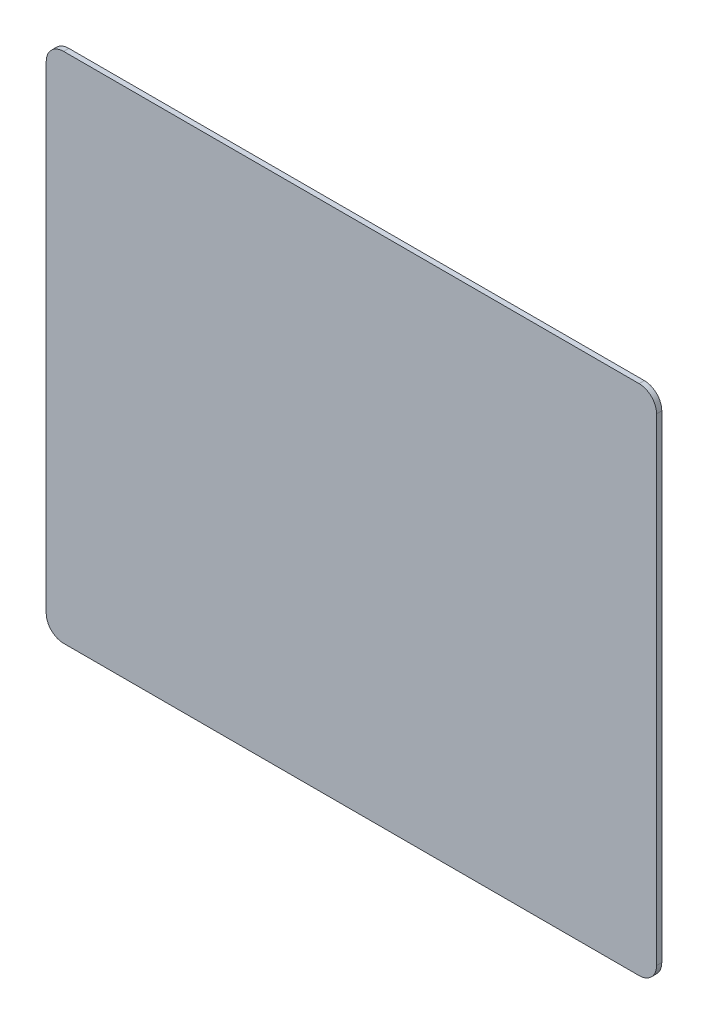
ISO-10303-21;
HEADER;
FILE_DESCRIPTION(('STEP AP214'),'2;1');
FILE_NAME('part.step','',(''),(''),'','','');
FILE_SCHEMA(('AUTOMOTIVE_DESIGN { 1 0 10303 214 1 1 1 1 }'));
ENDSEC;
DATA;
#1=APPLICATION_CONTEXT('core data for automotive mechanical design processes');
#2=APPLICATION_PROTOCOL_DEFINITION('international standard','automotive_design',2000,#1);
#3=PRODUCT_CONTEXT('',#1,'mechanical');
#4=PRODUCT('Part','Part','',(#3));
#5=PRODUCT_RELATED_PRODUCT_CATEGORY('part','',(#4));
#6=PRODUCT_DEFINITION_FORMATION('','',#4);
#7=PRODUCT_DEFINITION_CONTEXT('part definition',#1,'design');
#8=PRODUCT_DEFINITION('design','',#6,#7);
#9=PRODUCT_DEFINITION_SHAPE('','',#8);
#10=(LENGTH_UNIT() NAMED_UNIT(*) SI_UNIT(.MILLI.,.METRE.));
#11=(NAMED_UNIT(*) PLANE_ANGLE_UNIT() SI_UNIT($,.RADIAN.));
#12=(NAMED_UNIT(*) SI_UNIT($,.STERADIAN.) SOLID_ANGLE_UNIT());
#13=UNCERTAINTY_MEASURE_WITH_UNIT(LENGTH_MEASURE(1.E-05),#10,'distance_accuracy_value','');
#14=(GEOMETRIC_REPRESENTATION_CONTEXT(3) GLOBAL_UNCERTAINTY_ASSIGNED_CONTEXT((#13)) GLOBAL_UNIT_ASSIGNED_CONTEXT((#10,
#11,#12)) REPRESENTATION_CONTEXT('',''));
#15=CARTESIAN_POINT('',(0.,0.,0.));
#16=DIRECTION('',(0.,0.,1.));
#17=DIRECTION('',(1.,0.,0.));
#18=AXIS2_PLACEMENT_3D('',#15,#16,#17);
#19=CARTESIAN_POINT('',(350.,-294.,6.));
#20=DIRECTION('',(-1.,0.,0.));
#21=DIRECTION('',(0.,0.,1.));
#22=AXIS2_PLACEMENT_3D('',#19,#20,#21);
#23=PLANE('',#22);
#24=DIRECTION('',(0.,1.,0.));
#25=VECTOR('',#24,1.);
#26=CARTESIAN_POINT('',(350.,-294.,0.));
#27=LINE('',#26,#25);
#28=CARTESIAN_POINT('',(350.,-274.,0.));
#29=VERTEX_POINT('',#28);
#30=CARTESIAN_POINT('',(350.,274.,0.));
#31=VERTEX_POINT('',#30);
#32=EDGE_CURVE('E146',#29,#31,#27,.T.);
#33=ORIENTED_EDGE('',*,*,#32,.T.);
#34=DIRECTION('',(0.,0.,-1.));
#35=VECTOR('',#34,1.);
#36=CARTESIAN_POINT('',(350.,274.,6.));
#37=LINE('',#36,#35);
#38=CARTESIAN_POINT('',(350.,274.,6.));
#39=VERTEX_POINT('',#38);
#40=EDGE_CURVE('E180',#31,#39,#37,.F.);
#41=ORIENTED_EDGE('',*,*,#40,.T.);
#42=DIRECTION('',(0.,1.,0.));
#43=VECTOR('',#42,1.);
#44=CARTESIAN_POINT('',(350.,-294.,6.));
#45=LINE('',#44,#43);
#46=CARTESIAN_POINT('',(350.,-274.,6.));
#47=VERTEX_POINT('',#46);
#48=EDGE_CURVE('E144',#47,#39,#45,.T.);
#49=ORIENTED_EDGE('',*,*,#48,.F.);
#50=DIRECTION('',(0.,0.,-1.));
#51=VECTOR('',#50,1.);
#52=CARTESIAN_POINT('',(350.,-274.,6.));
#53=LINE('',#52,#51);
#54=EDGE_CURVE('E176',#47,#29,#53,.T.);
#55=ORIENTED_EDGE('',*,*,#54,.T.);
#56=EDGE_LOOP('',(#33,#41,#49,#55));
#57=FACE_BOUND('',#56,.T.);
#58=ADVANCED_FACE('F44',(#57),#23,.F.);
#59=CARTESIAN_POINT('',(-350.,294.,6.));
#60=DIRECTION('',(0.,-1.,0.));
#61=DIRECTION('',(0.,0.,-1.));
#62=AXIS2_PLACEMENT_3D('',#59,#60,#61);
#63=PLANE('',#62);
#64=DIRECTION('',(-1.,0.,0.));
#65=VECTOR('',#64,1.);
#66=CARTESIAN_POINT('',(-350.,294.,0.));
#67=LINE('',#66,#65);
#68=CARTESIAN_POINT('',(330.,294.,0.));
#69=VERTEX_POINT('',#68);
#70=CARTESIAN_POINT('',(-330.,294.,0.));
#71=VERTEX_POINT('',#70);
#72=EDGE_CURVE('E139',#69,#71,#67,.T.);
#73=ORIENTED_EDGE('',*,*,#72,.T.);
#74=DIRECTION('',(0.,0.,-1.));
#75=VECTOR('',#74,1.);
#76=CARTESIAN_POINT('',(-330.,294.,6.));
#77=LINE('',#76,#75);
#78=CARTESIAN_POINT('',(-330.,294.,6.));
#79=VERTEX_POINT('',#78);
#80=EDGE_CURVE('E115',#71,#79,#77,.F.);
#81=ORIENTED_EDGE('',*,*,#80,.T.);
#82=DIRECTION('',(-1.,0.,0.));
#83=VECTOR('',#82,1.);
#84=CARTESIAN_POINT('',(-350.,294.,6.));
#85=LINE('',#84,#83);
#86=CARTESIAN_POINT('',(330.,294.,6.));
#87=VERTEX_POINT('',#86);
#88=EDGE_CURVE('E200',#87,#79,#85,.T.);
#89=ORIENTED_EDGE('',*,*,#88,.F.);
#90=DIRECTION('',(0.,0.,-1.));
#91=VECTOR('',#90,1.);
#92=CARTESIAN_POINT('',(330.,294.,6.));
#93=LINE('',#92,#91);
#94=EDGE_CURVE('E121',#87,#69,#93,.T.);
#95=ORIENTED_EDGE('',*,*,#94,.T.);
#96=EDGE_LOOP('',(#73,#81,#89,#95));
#97=FACE_BOUND('',#96,.T.);
#98=ADVANCED_FACE('F225',(#97),#63,.F.);
#99=CARTESIAN_POINT('',(-350.,-294.,6.));
#100=DIRECTION('',(1.,0.,0.));
#101=DIRECTION('',(0.,0.,-1.));
#102=AXIS2_PLACEMENT_3D('',#99,#100,#101);
#103=PLANE('',#102);
#104=DIRECTION('',(0.,-1.,0.));
#105=VECTOR('',#104,1.);
#106=CARTESIAN_POINT('',(-350.,-294.,6.));
#107=LINE('',#106,#105);
#108=CARTESIAN_POINT('',(-350.,274.,6.));
#109=VERTEX_POINT('',#108);
#110=CARTESIAN_POINT('',(-350.,-274.,6.));
#111=VERTEX_POINT('',#110);
#112=EDGE_CURVE('E130',#109,#111,#107,.T.);
#113=ORIENTED_EDGE('',*,*,#112,.F.);
#114=DIRECTION('',(0.,0.,-1.));
#115=VECTOR('',#114,1.);
#116=CARTESIAN_POINT('',(-350.,274.,6.));
#117=LINE('',#116,#115);
#118=CARTESIAN_POINT('',(-350.,274.,0.));
#119=VERTEX_POINT('',#118);
#120=EDGE_CURVE('E114',#109,#119,#117,.T.);
#121=ORIENTED_EDGE('',*,*,#120,.T.);
#122=DIRECTION('',(0.,-1.,0.));
#123=VECTOR('',#122,1.);
#124=CARTESIAN_POINT('',(-350.,-294.,0.));
#125=LINE('',#124,#123);
#126=CARTESIAN_POINT('',(-350.,-274.,0.));
#127=VERTEX_POINT('',#126);
#128=EDGE_CURVE('E128',#119,#127,#125,.T.);
#129=ORIENTED_EDGE('',*,*,#128,.T.);
#130=DIRECTION('',(0.,0.,-1.));
#131=VECTOR('',#130,1.);
#132=CARTESIAN_POINT('',(-350.,-274.,6.));
#133=LINE('',#132,#131);
#134=EDGE_CURVE('E133',#127,#111,#133,.F.);
#135=ORIENTED_EDGE('',*,*,#134,.T.);
#136=EDGE_LOOP('',(#113,#121,#129,#135));
#137=FACE_BOUND('',#136,.T.);
#138=ADVANCED_FACE('F127',(#137),#103,.F.);
#139=CARTESIAN_POINT('',(-350.,-294.,6.));
#140=DIRECTION('',(0.,1.,0.));
#141=DIRECTION('',(0.,0.,1.));
#142=AXIS2_PLACEMENT_3D('',#139,#140,#141);
#143=PLANE('',#142);
#144=DIRECTION('',(1.,0.,0.));
#145=VECTOR('',#144,1.);
#146=CARTESIAN_POINT('',(-350.,-294.,0.));
#147=LINE('',#146,#145);
#148=CARTESIAN_POINT('',(-330.,-294.,0.));
#149=VERTEX_POINT('',#148);
#150=CARTESIAN_POINT('',(330.,-294.,0.));
#151=VERTEX_POINT('',#150);
#152=EDGE_CURVE('E138',#149,#151,#147,.T.);
#153=ORIENTED_EDGE('',*,*,#152,.T.);
#154=DIRECTION('',(0.,0.,-1.));
#155=VECTOR('',#154,1.);
#156=CARTESIAN_POINT('',(330.,-294.,6.));
#157=LINE('',#156,#155);
#158=CARTESIAN_POINT('',(330.,-294.,6.));
#159=VERTEX_POINT('',#158);
#160=EDGE_CURVE('E11',#151,#159,#157,.F.);
#161=ORIENTED_EDGE('',*,*,#160,.T.);
#162=DIRECTION('',(1.,0.,0.));
#163=VECTOR('',#162,1.);
#164=CARTESIAN_POINT('',(-350.,-294.,6.));
#165=LINE('',#164,#163);
#166=CARTESIAN_POINT('',(-330.,-294.,6.));
#167=VERTEX_POINT('',#166);
#168=EDGE_CURVE('E151',#167,#159,#165,.T.);
#169=ORIENTED_EDGE('',*,*,#168,.F.);
#170=DIRECTION('',(0.,0.,-1.));
#171=VECTOR('',#170,1.);
#172=CARTESIAN_POINT('',(-330.,-294.,6.));
#173=LINE('',#172,#171);
#174=EDGE_CURVE('E53',#167,#149,#173,.T.);
#175=ORIENTED_EDGE('',*,*,#174,.T.);
#176=EDGE_LOOP('',(#153,#161,#169,#175));
#177=FACE_BOUND('',#176,.T.);
#178=ADVANCED_FACE('F186',(#177),#143,.F.);
#179=CARTESIAN_POINT('',(0.,0.,6.));
#180=DIRECTION('',(0.,0.,-1.));
#181=DIRECTION('',(-1.,0.,0.));
#182=AXIS2_PLACEMENT_3D('',#179,#180,#181);
#183=PLANE('',#182);
#184=ORIENTED_EDGE('',*,*,#88,.T.);
#185=CARTESIAN_POINT('',(-330.,274.,6.));
#186=DIRECTION('',(0.,0.,-1.));
#187=DIRECTION('',(-1.,0.,0.));
#188=AXIS2_PLACEMENT_3D('',#185,#186,#187);
#189=CIRCLE('',#188,20.);
#190=EDGE_CURVE('E173',#79,#109,#189,.F.);
#191=ORIENTED_EDGE('',*,*,#190,.T.);
#192=ORIENTED_EDGE('',*,*,#112,.T.);
#193=CARTESIAN_POINT('',(-330.,-274.,6.));
#194=DIRECTION('',(0.,0.,-1.));
#195=DIRECTION('',(-1.,0.,0.));
#196=AXIS2_PLACEMENT_3D('',#193,#194,#195);
#197=CIRCLE('',#196,20.);
#198=EDGE_CURVE('E65',#111,#167,#197,.F.);
#199=ORIENTED_EDGE('',*,*,#198,.T.);
#200=ORIENTED_EDGE('',*,*,#168,.T.);
#201=CARTESIAN_POINT('',(330.,-274.,6.));
#202=DIRECTION('',(0.,0.,-1.));
#203=DIRECTION('',(-1.,0.,0.));
#204=AXIS2_PLACEMENT_3D('',#201,#202,#203);
#205=CIRCLE('',#204,20.);
#206=EDGE_CURVE('E167',#159,#47,#205,.F.);
#207=ORIENTED_EDGE('',*,*,#206,.T.);
#208=ORIENTED_EDGE('',*,*,#48,.T.);
#209=CARTESIAN_POINT('',(330.,274.,6.));
#210=DIRECTION('',(0.,0.,-1.));
#211=DIRECTION('',(-1.,0.,0.));
#212=AXIS2_PLACEMENT_3D('',#209,#210,#211);
#213=CIRCLE('',#212,20.);
#214=EDGE_CURVE('E170',#39,#87,#213,.F.);
#215=ORIENTED_EDGE('',*,*,#214,.T.);
#216=EDGE_LOOP('',(#184,#191,#192,#199,#200,#207,#208,#215));
#217=FACE_BOUND('',#216,.T.);
#218=ADVANCED_FACE('F214',(#217),#183,.F.);
#219=CARTESIAN_POINT('',(0.,0.,0.));
#220=DIRECTION('',(0.,0.,-1.));
#221=DIRECTION('',(-1.,0.,0.));
#222=AXIS2_PLACEMENT_3D('',#219,#220,#221);
#223=PLANE('',#222);
#224=ORIENTED_EDGE('',*,*,#128,.F.);
#225=CARTESIAN_POINT('',(-330.,274.,0.));
#226=DIRECTION('',(0.,0.,-1.));
#227=DIRECTION('',(-1.,0.,0.));
#228=AXIS2_PLACEMENT_3D('',#225,#226,#227);
#229=CIRCLE('',#228,20.);
#230=EDGE_CURVE('E110',#119,#71,#229,.T.);
#231=ORIENTED_EDGE('',*,*,#230,.T.);
#232=ORIENTED_EDGE('',*,*,#72,.F.);
#233=CARTESIAN_POINT('',(330.,274.,0.));
#234=DIRECTION('',(0.,0.,-1.));
#235=DIRECTION('',(-1.,0.,0.));
#236=AXIS2_PLACEMENT_3D('',#233,#234,#235);
#237=CIRCLE('',#236,20.);
#238=EDGE_CURVE('E122',#69,#31,#237,.T.);
#239=ORIENTED_EDGE('',*,*,#238,.T.);
#240=ORIENTED_EDGE('',*,*,#32,.F.);
#241=CARTESIAN_POINT('',(330.,-274.,0.));
#242=DIRECTION('',(0.,0.,-1.));
#243=DIRECTION('',(-1.,0.,0.));
#244=AXIS2_PLACEMENT_3D('',#241,#242,#243);
#245=CIRCLE('',#244,20.);
#246=EDGE_CURVE('E155',#29,#151,#245,.T.);
#247=ORIENTED_EDGE('',*,*,#246,.T.);
#248=ORIENTED_EDGE('',*,*,#152,.F.);
#249=CARTESIAN_POINT('',(-330.,-274.,0.));
#250=DIRECTION('',(0.,0.,-1.));
#251=DIRECTION('',(-1.,0.,0.));
#252=AXIS2_PLACEMENT_3D('',#249,#250,#251);
#253=CIRCLE('',#252,20.);
#254=EDGE_CURVE('E132',#149,#127,#253,.T.);
#255=ORIENTED_EDGE('',*,*,#254,.T.);
#256=EDGE_LOOP('',(#224,#231,#232,#239,#240,#247,#248,#255));
#257=FACE_BOUND('',#256,.T.);
#258=ADVANCED_FACE('F135',(#257),#223,.T.);
#259=CARTESIAN_POINT('',(-330.,274.,6.));
#260=DIRECTION('',(0.,0.,-1.));
#261=DIRECTION('',(-1.,0.,0.));
#262=AXIS2_PLACEMENT_3D('',#259,#260,#261);
#263=CYLINDRICAL_SURFACE('',#262,20.);
#264=ORIENTED_EDGE('',*,*,#190,.F.);
#265=ORIENTED_EDGE('',*,*,#80,.F.);
#266=ORIENTED_EDGE('',*,*,#230,.F.);
#267=ORIENTED_EDGE('',*,*,#120,.F.);
#268=EDGE_LOOP('',(#264,#265,#266,#267));
#269=FACE_BOUND('',#268,.T.);
#270=ADVANCED_FACE('F113',(#269),#263,.T.);
#271=CARTESIAN_POINT('',(330.,274.,6.));
#272=DIRECTION('',(0.,0.,-1.));
#273=DIRECTION('',(-1.,0.,0.));
#274=AXIS2_PLACEMENT_3D('',#271,#272,#273);
#275=CYLINDRICAL_SURFACE('',#274,20.);
#276=ORIENTED_EDGE('',*,*,#214,.F.);
#277=ORIENTED_EDGE('',*,*,#40,.F.);
#278=ORIENTED_EDGE('',*,*,#238,.F.);
#279=ORIENTED_EDGE('',*,*,#94,.F.);
#280=EDGE_LOOP('',(#276,#277,#278,#279));
#281=FACE_BOUND('',#280,.T.);
#282=ADVANCED_FACE('F236',(#281),#275,.T.);
#283=CARTESIAN_POINT('',(330.,-274.,6.));
#284=DIRECTION('',(0.,0.,-1.));
#285=DIRECTION('',(-1.,0.,0.));
#286=AXIS2_PLACEMENT_3D('',#283,#284,#285);
#287=CYLINDRICAL_SURFACE('',#286,20.);
#288=ORIENTED_EDGE('',*,*,#206,.F.);
#289=ORIENTED_EDGE('',*,*,#160,.F.);
#290=ORIENTED_EDGE('',*,*,#246,.F.);
#291=ORIENTED_EDGE('',*,*,#54,.F.);
#292=EDGE_LOOP('',(#288,#289,#290,#291));
#293=FACE_BOUND('',#292,.T.);
#294=ADVANCED_FACE('F193',(#293),#287,.T.);
#295=CARTESIAN_POINT('',(-330.,-274.,6.));
#296=DIRECTION('',(0.,0.,-1.));
#297=DIRECTION('',(-1.,0.,0.));
#298=AXIS2_PLACEMENT_3D('',#295,#296,#297);
#299=CYLINDRICAL_SURFACE('',#298,20.);
#300=ORIENTED_EDGE('',*,*,#198,.F.);
#301=ORIENTED_EDGE('',*,*,#134,.F.);
#302=ORIENTED_EDGE('',*,*,#254,.F.);
#303=ORIENTED_EDGE('',*,*,#174,.F.);
#304=EDGE_LOOP('',(#300,#301,#302,#303));
#305=FACE_BOUND('',#304,.T.);
#306=ADVANCED_FACE('F46',(#305),#299,.T.);
#307=CLOSED_SHELL('',(#58,#98,#138,#178,#218,#258,#270,#282,#294,#306));
#308=MANIFOLD_SOLID_BREP('B2',#307);
#309=ADVANCED_BREP_SHAPE_REPRESENTATION('',(#18,#308),#14);
#310=SHAPE_DEFINITION_REPRESENTATION(#9,#309);
ENDSEC;
END-ISO-10303-21;
